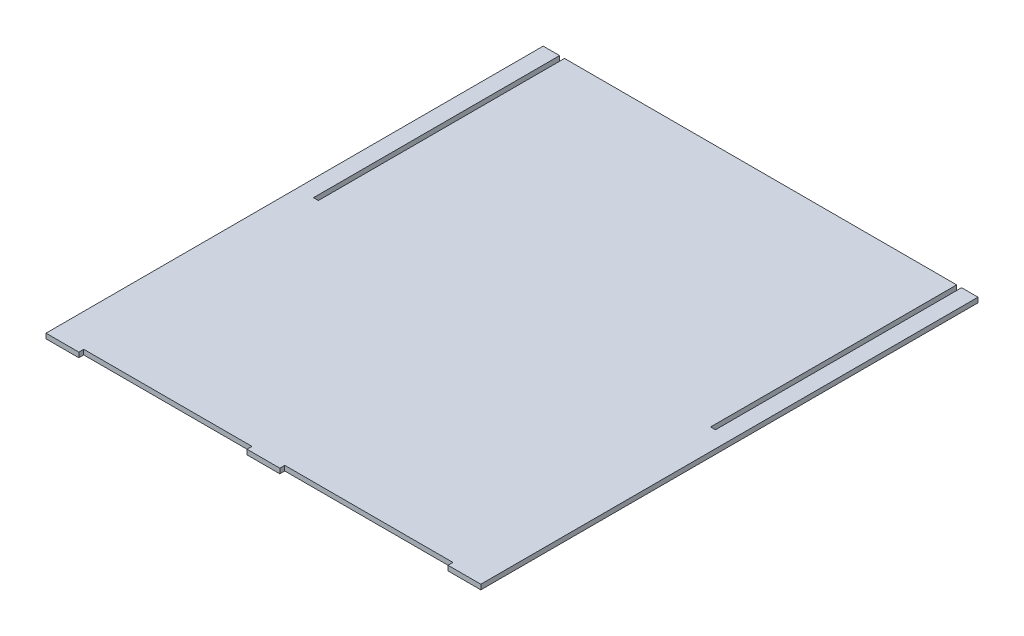
ISO-10303-21;
HEADER;
FILE_DESCRIPTION(('STEP AP214'),'2;1');
FILE_NAME('part.step','',(''),(''),'','','');
FILE_SCHEMA(('AUTOMOTIVE_DESIGN { 1 0 10303 214 1 1 1 1 }'));
ENDSEC;
DATA;
#1=APPLICATION_CONTEXT('core data for automotive mechanical design processes');
#2=APPLICATION_PROTOCOL_DEFINITION('international standard','automotive_design',2000,#1);
#3=PRODUCT_CONTEXT('',#1,'mechanical');
#4=PRODUCT('Part','Part','',(#3));
#5=PRODUCT_RELATED_PRODUCT_CATEGORY('part','',(#4));
#6=PRODUCT_DEFINITION_FORMATION('','',#4);
#7=PRODUCT_DEFINITION_CONTEXT('part definition',#1,'design');
#8=PRODUCT_DEFINITION('design','',#6,#7);
#9=PRODUCT_DEFINITION_SHAPE('','',#8);
#10=(LENGTH_UNIT() NAMED_UNIT(*) SI_UNIT(.MILLI.,.METRE.));
#11=(NAMED_UNIT(*) PLANE_ANGLE_UNIT() SI_UNIT($,.RADIAN.));
#12=(NAMED_UNIT(*) SI_UNIT($,.STERADIAN.) SOLID_ANGLE_UNIT());
#13=UNCERTAINTY_MEASURE_WITH_UNIT(LENGTH_MEASURE(1.E-05),#10,'distance_accuracy_value','');
#14=(GEOMETRIC_REPRESENTATION_CONTEXT(3) GLOBAL_UNCERTAINTY_ASSIGNED_CONTEXT((#13)) GLOBAL_UNIT_ASSIGNED_CONTEXT((#10,
#11,#12)) REPRESENTATION_CONTEXT('',''));
#15=CARTESIAN_POINT('',(0.,0.,0.));
#16=DIRECTION('',(0.,0.,1.));
#17=DIRECTION('',(1.,0.,0.));
#18=AXIS2_PLACEMENT_3D('',#15,#16,#17);
#19=CARTESIAN_POINT('',(0.,6.,-606.));
#20=DIRECTION('',(0.,0.,1.));
#21=DIRECTION('',(1.,0.,0.));
#22=AXIS2_PLACEMENT_3D('',#19,#20,#21);
#23=PLANE('',#22);
#24=DIRECTION('',(-1.,0.,0.));
#25=VECTOR('',#24,1.);
#26=CARTESIAN_POINT('',(0.,0.,-606.));
#27=LINE('',#26,#25);
#28=CARTESIAN_POINT('',(-26.,0.,-606.));
#29=VERTEX_POINT('',#28);
#30=CARTESIAN_POINT('',(-504.,0.,-606.));
#31=VERTEX_POINT('',#30);
#32=EDGE_CURVE('E194',#29,#31,#27,.T.);
#33=ORIENTED_EDGE('',*,*,#32,.T.);
#34=DIRECTION('',(0.,1.,0.));
#35=VECTOR('',#34,1.);
#36=CARTESIAN_POINT('',(-504.,0.,-606.));
#37=LINE('',#36,#35);
#38=CARTESIAN_POINT('',(-504.,6.,-606.));
#39=VERTEX_POINT('',#38);
#40=EDGE_CURVE('E178',#31,#39,#37,.T.);
#41=ORIENTED_EDGE('',*,*,#40,.T.);
#42=DIRECTION('',(-1.,0.,0.));
#43=VECTOR('',#42,1.);
#44=CARTESIAN_POINT('',(0.,6.,-606.));
#45=LINE('',#44,#43);
#46=CARTESIAN_POINT('',(-26.,6.,-606.));
#47=VERTEX_POINT('',#46);
#48=EDGE_CURVE('E339',#47,#39,#45,.T.);
#49=ORIENTED_EDGE('',*,*,#48,.F.);
#50=DIRECTION('',(0.,1.,0.));
#51=VECTOR('',#50,1.);
#52=CARTESIAN_POINT('',(-26.,0.,-606.));
#53=LINE('',#52,#51);
#54=EDGE_CURVE('E200',#29,#47,#53,.T.);
#55=ORIENTED_EDGE('',*,*,#54,.F.);
#56=EDGE_LOOP('',(#33,#41,#49,#55));
#57=FACE_BOUND('',#56,.T.);
#58=ADVANCED_FACE('F41',(#57),#23,.F.);
#59=CARTESIAN_POINT('',(0.,0.,-606.));
#60=VERTEX_POINT('',#59);
#61=CARTESIAN_POINT('',(-20.,0.,-606.));
#62=VERTEX_POINT('',#61);
#63=EDGE_CURVE('E201',#60,#62,#27,.T.);
#64=ORIENTED_EDGE('',*,*,#63,.T.);
#65=DIRECTION('',(0.,1.,0.));
#66=VECTOR('',#65,1.);
#67=CARTESIAN_POINT('',(-20.,0.,-606.));
#68=LINE('',#67,#66);
#69=CARTESIAN_POINT('',(-20.,6.,-606.));
#70=VERTEX_POINT('',#69);
#71=EDGE_CURVE('E300',#62,#70,#68,.T.);
#72=ORIENTED_EDGE('',*,*,#71,.T.);
#73=CARTESIAN_POINT('',(0.,6.,-606.));
#74=VERTEX_POINT('',#73);
#75=EDGE_CURVE('E285',#74,#70,#45,.T.);
#76=ORIENTED_EDGE('',*,*,#75,.F.);
#77=DIRECTION('',(0.,-1.,0.));
#78=VECTOR('',#77,1.);
#79=CARTESIAN_POINT('',(0.,6.,-606.));
#80=LINE('',#79,#78);
#81=EDGE_CURVE('E219',#74,#60,#80,.T.);
#82=ORIENTED_EDGE('',*,*,#81,.T.);
#83=EDGE_LOOP('',(#64,#72,#76,#82));
#84=FACE_BOUND('',#83,.T.);
#85=ADVANCED_FACE('F282',(#84),#23,.F.);
#86=CARTESIAN_POINT('',(-530.,6.,0.));
#87=DIRECTION('',(0.,0.,-1.));
#88=DIRECTION('',(-1.,0.,0.));
#89=AXIS2_PLACEMENT_3D('',#86,#87,#88);
#90=PLANE('',#89);
#91=DIRECTION('',(1.,0.,0.));
#92=VECTOR('',#91,1.);
#93=CARTESIAN_POINT('',(-530.,0.,0.));
#94=LINE('',#93,#92);
#95=CARTESIAN_POINT('',(-530.,0.,0.));
#96=VERTEX_POINT('',#95);
#97=CARTESIAN_POINT('',(-490.,0.,0.));
#98=VERTEX_POINT('',#97);
#99=EDGE_CURVE('E252',#96,#98,#94,.T.);
#100=ORIENTED_EDGE('',*,*,#99,.T.);
#101=DIRECTION('',(0.,-1.,0.));
#102=VECTOR('',#101,1.);
#103=CARTESIAN_POINT('',(-490.,6.,0.));
#104=LINE('',#103,#102);
#105=CARTESIAN_POINT('',(-490.,6.,0.));
#106=VERTEX_POINT('',#105);
#107=EDGE_CURVE('E11',#106,#98,#104,.T.);
#108=ORIENTED_EDGE('',*,*,#107,.F.);
#109=DIRECTION('',(1.,0.,0.));
#110=VECTOR('',#109,1.);
#111=CARTESIAN_POINT('',(-530.,6.,0.));
#112=LINE('',#111,#110);
#113=CARTESIAN_POINT('',(-530.,6.,0.));
#114=VERTEX_POINT('',#113);
#115=EDGE_CURVE('E212',#114,#106,#112,.T.);
#116=ORIENTED_EDGE('',*,*,#115,.F.);
#117=DIRECTION('',(0.,-1.,0.));
#118=VECTOR('',#117,1.);
#119=CARTESIAN_POINT('',(-530.,6.,0.));
#120=LINE('',#119,#118);
#121=EDGE_CURVE('E213',#114,#96,#120,.T.);
#122=ORIENTED_EDGE('',*,*,#121,.T.);
#123=EDGE_LOOP('',(#100,#108,#116,#122));
#124=FACE_BOUND('',#123,.T.);
#125=ADVANCED_FACE('F43',(#124),#90,.F.);
#126=CARTESIAN_POINT('',(-490.,6.,0.));
#127=DIRECTION('',(-1.,0.,0.));
#128=DIRECTION('',(0.,0.,1.));
#129=AXIS2_PLACEMENT_3D('',#126,#127,#128);
#130=PLANE('',#129);
#131=DIRECTION('',(0.,0.,-1.));
#132=VECTOR('',#131,1.);
#133=CARTESIAN_POINT('',(-490.,0.,0.));
#134=LINE('',#133,#132);
#135=CARTESIAN_POINT('',(-490.,0.,-6.));
#136=VERTEX_POINT('',#135);
#137=EDGE_CURVE('E247',#98,#136,#134,.T.);
#138=ORIENTED_EDGE('',*,*,#137,.T.);
#139=DIRECTION('',(0.,-1.,0.));
#140=VECTOR('',#139,1.);
#141=CARTESIAN_POINT('',(-490.,6.,-6.));
#142=LINE('',#141,#140);
#143=CARTESIAN_POINT('',(-490.,6.,-6.));
#144=VERTEX_POINT('',#143);
#145=EDGE_CURVE('E49',#144,#136,#142,.T.);
#146=ORIENTED_EDGE('',*,*,#145,.F.);
#147=DIRECTION('',(0.,0.,-1.));
#148=VECTOR('',#147,1.);
#149=CARTESIAN_POINT('',(-490.,6.,0.));
#150=LINE('',#149,#148);
#151=EDGE_CURVE('E314',#106,#144,#150,.T.);
#152=ORIENTED_EDGE('',*,*,#151,.F.);
#153=ORIENTED_EDGE('',*,*,#107,.T.);
#154=EDGE_LOOP('',(#138,#146,#152,#153));
#155=FACE_BOUND('',#154,.T.);
#156=ADVANCED_FACE('F248',(#155),#130,.F.);
#157=CARTESIAN_POINT('',(-285.,6.,-6.));
#158=DIRECTION('',(0.,0.,1.));
#159=DIRECTION('',(1.,0.,0.));
#160=AXIS2_PLACEMENT_3D('',#157,#158,#159);
#161=PLANE('',#160);
#162=DIRECTION('',(-1.,0.,0.));
#163=VECTOR('',#162,1.);
#164=CARTESIAN_POINT('',(-285.,0.,-6.));
#165=LINE('',#164,#163);
#166=CARTESIAN_POINT('',(-285.,0.,-6.));
#167=VERTEX_POINT('',#166);
#168=EDGE_CURVE('E242',#167,#136,#165,.T.);
#169=ORIENTED_EDGE('',*,*,#168,.F.);
#170=DIRECTION('',(0.,-1.,0.));
#171=VECTOR('',#170,1.);
#172=CARTESIAN_POINT('',(-285.,6.,-6.));
#173=LINE('',#172,#171);
#174=CARTESIAN_POINT('',(-285.,6.,-6.));
#175=VERTEX_POINT('',#174);
#176=EDGE_CURVE('E234',#175,#167,#173,.T.);
#177=ORIENTED_EDGE('',*,*,#176,.F.);
#178=DIRECTION('',(-1.,0.,0.));
#179=VECTOR('',#178,1.);
#180=CARTESIAN_POINT('',(-285.,6.,-6.));
#181=LINE('',#180,#179);
#182=EDGE_CURVE('E245',#175,#144,#181,.T.);
#183=ORIENTED_EDGE('',*,*,#182,.T.);
#184=ORIENTED_EDGE('',*,*,#145,.T.);
#185=EDGE_LOOP('',(#169,#177,#183,#184));
#186=FACE_BOUND('',#185,.T.);
#187=ADVANCED_FACE('F240',(#186),#161,.T.);
#188=CARTESIAN_POINT('',(-285.,6.,0.));
#189=DIRECTION('',(-1.,0.,0.));
#190=DIRECTION('',(0.,0.,1.));
#191=AXIS2_PLACEMENT_3D('',#188,#189,#190);
#192=PLANE('',#191);
#193=DIRECTION('',(0.,0.,-1.));
#194=VECTOR('',#193,1.);
#195=CARTESIAN_POINT('',(-285.,0.,0.));
#196=LINE('',#195,#194);
#197=CARTESIAN_POINT('',(-285.,0.,0.));
#198=VERTEX_POINT('',#197);
#199=EDGE_CURVE('E256',#198,#167,#196,.T.);
#200=ORIENTED_EDGE('',*,*,#199,.F.);
#201=DIRECTION('',(0.,-1.,0.));
#202=VECTOR('',#201,1.);
#203=CARTESIAN_POINT('',(-285.,6.,0.));
#204=LINE('',#203,#202);
#205=CARTESIAN_POINT('',(-285.,6.,0.));
#206=VERTEX_POINT('',#205);
#207=EDGE_CURVE('E232',#206,#198,#204,.T.);
#208=ORIENTED_EDGE('',*,*,#207,.F.);
#209=DIRECTION('',(0.,0.,-1.));
#210=VECTOR('',#209,1.);
#211=CARTESIAN_POINT('',(-285.,6.,0.));
#212=LINE('',#211,#210);
#213=EDGE_CURVE('E317',#206,#175,#212,.T.);
#214=ORIENTED_EDGE('',*,*,#213,.T.);
#215=ORIENTED_EDGE('',*,*,#176,.T.);
#216=EDGE_LOOP('',(#200,#208,#214,#215));
#217=FACE_BOUND('',#216,.T.);
#218=ADVANCED_FACE('F416',(#217),#192,.T.);
#219=CARTESIAN_POINT('',(-245.,6.,0.));
#220=DIRECTION('',(0.,0.,1.));
#221=DIRECTION('',(1.,0.,0.));
#222=AXIS2_PLACEMENT_3D('',#219,#220,#221);
#223=PLANE('',#222);
#224=DIRECTION('',(-1.,0.,0.));
#225=VECTOR('',#224,1.);
#226=CARTESIAN_POINT('',(-245.,0.,0.));
#227=LINE('',#226,#225);
#228=CARTESIAN_POINT('',(-245.,0.,0.));
#229=VERTEX_POINT('',#228);
#230=EDGE_CURVE('E258',#229,#198,#227,.T.);
#231=ORIENTED_EDGE('',*,*,#230,.F.);
#232=DIRECTION('',(0.,-1.,0.));
#233=VECTOR('',#232,1.);
#234=CARTESIAN_POINT('',(-245.,6.,0.));
#235=LINE('',#234,#233);
#236=CARTESIAN_POINT('',(-245.,6.,0.));
#237=VERTEX_POINT('',#236);
#238=EDGE_CURVE('E230',#237,#229,#235,.T.);
#239=ORIENTED_EDGE('',*,*,#238,.F.);
#240=DIRECTION('',(-1.,0.,0.));
#241=VECTOR('',#240,1.);
#242=CARTESIAN_POINT('',(-245.,6.,0.));
#243=LINE('',#242,#241);
#244=EDGE_CURVE('E320',#237,#206,#243,.T.);
#245=ORIENTED_EDGE('',*,*,#244,.T.);
#246=ORIENTED_EDGE('',*,*,#207,.T.);
#247=EDGE_LOOP('',(#231,#239,#245,#246));
#248=FACE_BOUND('',#247,.T.);
#249=ADVANCED_FACE('F412',(#248),#223,.T.);
#250=CARTESIAN_POINT('',(-245.,6.,-6.));
#251=DIRECTION('',(1.,0.,0.));
#252=DIRECTION('',(0.,0.,-1.));
#253=AXIS2_PLACEMENT_3D('',#250,#251,#252);
#254=PLANE('',#253);
#255=DIRECTION('',(0.,0.,1.));
#256=VECTOR('',#255,1.);
#257=CARTESIAN_POINT('',(-245.,0.,-6.));
#258=LINE('',#257,#256);
#259=CARTESIAN_POINT('',(-245.,0.,-6.));
#260=VERTEX_POINT('',#259);
#261=EDGE_CURVE('E263',#260,#229,#258,.T.);
#262=ORIENTED_EDGE('',*,*,#261,.F.);
#263=DIRECTION('',(0.,-1.,0.));
#264=VECTOR('',#263,1.);
#265=CARTESIAN_POINT('',(-245.,6.,-6.));
#266=LINE('',#265,#264);
#267=CARTESIAN_POINT('',(-245.,6.,-6.));
#268=VERTEX_POINT('',#267);
#269=EDGE_CURVE('E228',#268,#260,#266,.T.);
#270=ORIENTED_EDGE('',*,*,#269,.F.);
#271=DIRECTION('',(0.,0.,1.));
#272=VECTOR('',#271,1.);
#273=CARTESIAN_POINT('',(-245.,6.,-6.));
#274=LINE('',#273,#272);
#275=EDGE_CURVE('E323',#268,#237,#274,.T.);
#276=ORIENTED_EDGE('',*,*,#275,.T.);
#277=ORIENTED_EDGE('',*,*,#238,.T.);
#278=EDGE_LOOP('',(#262,#270,#276,#277));
#279=FACE_BOUND('',#278,.T.);
#280=ADVANCED_FACE('F408',(#279),#254,.T.);
#281=CARTESIAN_POINT('',(-40.,6.,-5.99999999999999));
#282=DIRECTION('',(0.,0.,1.));
#283=DIRECTION('',(1.,0.,0.));
#284=AXIS2_PLACEMENT_3D('',#281,#282,#283);
#285=PLANE('',#284);
#286=DIRECTION('',(-1.,0.,0.));
#287=VECTOR('',#286,1.);
#288=CARTESIAN_POINT('',(-40.,0.,-5.99999999999999));
#289=LINE('',#288,#287);
#290=CARTESIAN_POINT('',(-40.,0.,-5.99999999999999));
#291=VERTEX_POINT('',#290);
#292=EDGE_CURVE('E266',#291,#260,#289,.T.);
#293=ORIENTED_EDGE('',*,*,#292,.F.);
#294=DIRECTION('',(0.,-1.,0.));
#295=VECTOR('',#294,1.);
#296=CARTESIAN_POINT('',(-40.,6.,-5.99999999999999));
#297=LINE('',#296,#295);
#298=CARTESIAN_POINT('',(-40.,6.,-5.99999999999999));
#299=VERTEX_POINT('',#298);
#300=EDGE_CURVE('E226',#299,#291,#297,.T.);
#301=ORIENTED_EDGE('',*,*,#300,.F.);
#302=DIRECTION('',(-1.,0.,0.));
#303=VECTOR('',#302,1.);
#304=CARTESIAN_POINT('',(-40.,6.,-5.99999999999999));
#305=LINE('',#304,#303);
#306=EDGE_CURVE('E326',#299,#268,#305,.T.);
#307=ORIENTED_EDGE('',*,*,#306,.T.);
#308=ORIENTED_EDGE('',*,*,#269,.T.);
#309=EDGE_LOOP('',(#293,#301,#307,#308));
#310=FACE_BOUND('',#309,.T.);
#311=ADVANCED_FACE('F404',(#310),#285,.T.);
#312=CARTESIAN_POINT('',(-40.,6.,0.));
#313=DIRECTION('',(-1.,0.,0.));
#314=DIRECTION('',(0.,0.,1.));
#315=AXIS2_PLACEMENT_3D('',#312,#313,#314);
#316=PLANE('',#315);
#317=DIRECTION('',(0.,0.,-1.));
#318=VECTOR('',#317,1.);
#319=CARTESIAN_POINT('',(-40.,0.,0.));
#320=LINE('',#319,#318);
#321=CARTESIAN_POINT('',(-40.,0.,0.));
#322=VERTEX_POINT('',#321);
#323=EDGE_CURVE('E269',#322,#291,#320,.T.);
#324=ORIENTED_EDGE('',*,*,#323,.F.);
#325=DIRECTION('',(0.,-1.,0.));
#326=VECTOR('',#325,1.);
#327=CARTESIAN_POINT('',(-40.,6.,0.));
#328=LINE('',#327,#326);
#329=CARTESIAN_POINT('',(-40.,6.,0.));
#330=VERTEX_POINT('',#329);
#331=EDGE_CURVE('E224',#330,#322,#328,.T.);
#332=ORIENTED_EDGE('',*,*,#331,.F.);
#333=DIRECTION('',(0.,0.,-1.));
#334=VECTOR('',#333,1.);
#335=CARTESIAN_POINT('',(-40.,6.,0.));
#336=LINE('',#335,#334);
#337=EDGE_CURVE('E329',#330,#299,#336,.T.);
#338=ORIENTED_EDGE('',*,*,#337,.T.);
#339=ORIENTED_EDGE('',*,*,#300,.T.);
#340=EDGE_LOOP('',(#324,#332,#338,#339));
#341=FACE_BOUND('',#340,.T.);
#342=ADVANCED_FACE('F398',(#341),#316,.T.);
#343=CARTESIAN_POINT('',(0.,6.,0.));
#344=DIRECTION('',(0.,0.,1.));
#345=DIRECTION('',(1.,0.,0.));
#346=AXIS2_PLACEMENT_3D('',#343,#344,#345);
#347=PLANE('',#346);
#348=DIRECTION('',(-1.,0.,0.));
#349=VECTOR('',#348,1.);
#350=CARTESIAN_POINT('',(0.,0.,0.));
#351=LINE('',#350,#349);
#352=CARTESIAN_POINT('',(0.,0.,0.));
#353=VERTEX_POINT('',#352);
#354=EDGE_CURVE('E271',#353,#322,#351,.T.);
#355=ORIENTED_EDGE('',*,*,#354,.F.);
#356=DIRECTION('',(0.,-1.,0.));
#357=VECTOR('',#356,1.);
#358=CARTESIAN_POINT('',(0.,6.,0.));
#359=LINE('',#358,#357);
#360=CARTESIAN_POINT('',(0.,6.,0.));
#361=VERTEX_POINT('',#360);
#362=EDGE_CURVE('E222',#361,#353,#359,.T.);
#363=ORIENTED_EDGE('',*,*,#362,.F.);
#364=DIRECTION('',(-1.,0.,0.));
#365=VECTOR('',#364,1.);
#366=CARTESIAN_POINT('',(0.,6.,0.));
#367=LINE('',#366,#365);
#368=EDGE_CURVE('E332',#361,#330,#367,.T.);
#369=ORIENTED_EDGE('',*,*,#368,.T.);
#370=ORIENTED_EDGE('',*,*,#331,.T.);
#371=EDGE_LOOP('',(#355,#363,#369,#370));
#372=FACE_BOUND('',#371,.T.);
#373=ADVANCED_FACE('F394',(#372),#347,.T.);
#374=CARTESIAN_POINT('',(0.,6.,0.));
#375=DIRECTION('',(-1.,0.,0.));
#376=DIRECTION('',(0.,0.,1.));
#377=AXIS2_PLACEMENT_3D('',#374,#375,#376);
#378=PLANE('',#377);
#379=DIRECTION('',(0.,0.,-1.));
#380=VECTOR('',#379,1.);
#381=CARTESIAN_POINT('',(0.,0.,0.));
#382=LINE('',#381,#380);
#383=EDGE_CURVE('E206',#353,#60,#382,.T.);
#384=ORIENTED_EDGE('',*,*,#383,.T.);
#385=ORIENTED_EDGE('',*,*,#81,.F.);
#386=DIRECTION('',(0.,0.,-1.));
#387=VECTOR('',#386,1.);
#388=CARTESIAN_POINT('',(0.,6.,0.));
#389=LINE('',#388,#387);
#390=EDGE_CURVE('E335',#361,#74,#389,.T.);
#391=ORIENTED_EDGE('',*,*,#390,.F.);
#392=ORIENTED_EDGE('',*,*,#362,.T.);
#393=EDGE_LOOP('',(#384,#385,#391,#392));
#394=FACE_BOUND('',#393,.T.);
#395=ADVANCED_FACE('F277',(#394),#378,.F.);
#396=CARTESIAN_POINT('',(-510.,6.,-606.));
#397=VERTEX_POINT('',#396);
#398=CARTESIAN_POINT('',(-530.,6.,-606.));
#399=VERTEX_POINT('',#398);
#400=EDGE_CURVE('E337',#397,#399,#45,.T.);
#401=ORIENTED_EDGE('',*,*,#400,.F.);
#402=DIRECTION('',(0.,1.,0.));
#403=VECTOR('',#402,1.);
#404=CARTESIAN_POINT('',(-510.,0.,-606.));
#405=LINE('',#404,#403);
#406=CARTESIAN_POINT('',(-510.,0.,-606.));
#407=VERTEX_POINT('',#406);
#408=EDGE_CURVE('E188',#407,#397,#405,.T.);
#409=ORIENTED_EDGE('',*,*,#408,.F.);
#410=CARTESIAN_POINT('',(-530.,0.,-606.));
#411=VERTEX_POINT('',#410);
#412=EDGE_CURVE('E202',#407,#411,#27,.T.);
#413=ORIENTED_EDGE('',*,*,#412,.T.);
#414=DIRECTION('',(0.,-1.,0.));
#415=VECTOR('',#414,1.);
#416=CARTESIAN_POINT('',(-530.,6.,-606.));
#417=LINE('',#416,#415);
#418=EDGE_CURVE('E215',#399,#411,#417,.T.);
#419=ORIENTED_EDGE('',*,*,#418,.F.);
#420=EDGE_LOOP('',(#401,#409,#413,#419));
#421=FACE_BOUND('',#420,.T.);
#422=ADVANCED_FACE('F351',(#421),#23,.F.);
#423=CARTESIAN_POINT('',(-530.,6.,0.));
#424=DIRECTION('',(-1.,0.,0.));
#425=DIRECTION('',(0.,0.,1.));
#426=AXIS2_PLACEMENT_3D('',#423,#424,#425);
#427=PLANE('',#426);
#428=DIRECTION('',(0.,0.,-1.));
#429=VECTOR('',#428,1.);
#430=CARTESIAN_POINT('',(-530.,0.,0.));
#431=LINE('',#430,#429);
#432=EDGE_CURVE('E205',#96,#411,#431,.T.);
#433=ORIENTED_EDGE('',*,*,#432,.F.);
#434=ORIENTED_EDGE('',*,*,#121,.F.);
#435=DIRECTION('',(0.,0.,-1.));
#436=VECTOR('',#435,1.);
#437=CARTESIAN_POINT('',(-530.,6.,0.));
#438=LINE('',#437,#436);
#439=EDGE_CURVE('E216',#114,#399,#438,.T.);
#440=ORIENTED_EDGE('',*,*,#439,.T.);
#441=ORIENTED_EDGE('',*,*,#418,.T.);
#442=EDGE_LOOP('',(#433,#434,#440,#441));
#443=FACE_BOUND('',#442,.T.);
#444=ADVANCED_FACE('F346',(#443),#427,.T.);
#445=CARTESIAN_POINT('',(0.,6.,0.));
#446=DIRECTION('',(0.,1.,0.));
#447=DIRECTION('',(0.,0.,1.));
#448=AXIS2_PLACEMENT_3D('',#445,#446,#447);
#449=PLANE('',#448);
#450=DIRECTION('',(0.,0.,-1.));
#451=VECTOR('',#450,1.);
#452=CARTESIAN_POINT('',(-504.,6.,-606.));
#453=LINE('',#452,#451);
#454=CARTESIAN_POINT('',(-504.,6.,-306.));
#455=VERTEX_POINT('',#454);
#456=EDGE_CURVE('E183',#455,#39,#453,.T.);
#457=ORIENTED_EDGE('',*,*,#456,.F.);
#458=DIRECTION('',(1.,0.,0.));
#459=VECTOR('',#458,1.);
#460=CARTESIAN_POINT('',(-504.,6.,-306.));
#461=LINE('',#460,#459);
#462=CARTESIAN_POINT('',(-510.,6.,-306.));
#463=VERTEX_POINT('',#462);
#464=EDGE_CURVE('E197',#463,#455,#461,.T.);
#465=ORIENTED_EDGE('',*,*,#464,.F.);
#466=DIRECTION('',(0.,0.,1.));
#467=VECTOR('',#466,1.);
#468=CARTESIAN_POINT('',(-510.,6.,-606.));
#469=LINE('',#468,#467);
#470=EDGE_CURVE('E358',#397,#463,#469,.T.);
#471=ORIENTED_EDGE('',*,*,#470,.F.);
#472=ORIENTED_EDGE('',*,*,#400,.T.);
#473=ORIENTED_EDGE('',*,*,#439,.F.);
#474=ORIENTED_EDGE('',*,*,#115,.T.);
#475=ORIENTED_EDGE('',*,*,#151,.T.);
#476=ORIENTED_EDGE('',*,*,#182,.F.);
#477=ORIENTED_EDGE('',*,*,#213,.F.);
#478=ORIENTED_EDGE('',*,*,#244,.F.);
#479=ORIENTED_EDGE('',*,*,#275,.F.);
#480=ORIENTED_EDGE('',*,*,#306,.F.);
#481=ORIENTED_EDGE('',*,*,#337,.F.);
#482=ORIENTED_EDGE('',*,*,#368,.F.);
#483=ORIENTED_EDGE('',*,*,#390,.T.);
#484=ORIENTED_EDGE('',*,*,#75,.T.);
#485=DIRECTION('',(0.,0.,-1.));
#486=VECTOR('',#485,1.);
#487=CARTESIAN_POINT('',(-20.,6.,-606.));
#488=LINE('',#487,#486);
#489=CARTESIAN_POINT('',(-20.,6.,-306.));
#490=VERTEX_POINT('',#489);
#491=EDGE_CURVE('E301',#490,#70,#488,.T.);
#492=ORIENTED_EDGE('',*,*,#491,.F.);
#493=DIRECTION('',(1.,0.,0.));
#494=VECTOR('',#493,1.);
#495=CARTESIAN_POINT('',(-20.,6.,-306.));
#496=LINE('',#495,#494);
#497=CARTESIAN_POINT('',(-26.,6.,-306.));
#498=VERTEX_POINT('',#497);
#499=EDGE_CURVE('E291',#498,#490,#496,.T.);
#500=ORIENTED_EDGE('',*,*,#499,.F.);
#501=DIRECTION('',(0.,0.,1.));
#502=VECTOR('',#501,1.);
#503=CARTESIAN_POINT('',(-26.,6.,-606.));
#504=LINE('',#503,#502);
#505=EDGE_CURVE('E295',#47,#498,#504,.T.);
#506=ORIENTED_EDGE('',*,*,#505,.F.);
#507=ORIENTED_EDGE('',*,*,#48,.T.);
#508=EDGE_LOOP('',(#457,#465,#471,#472,#473,#474,#475,#476,#477,#478,#479,#480,#481,#482,#483,
#484,#492,#500,#506,#507));
#509=FACE_BOUND('',#508,.T.);
#510=ADVANCED_FACE('F369',(#509),#449,.T.);
#511=CARTESIAN_POINT('',(0.,0.,0.));
#512=DIRECTION('',(0.,1.,0.));
#513=DIRECTION('',(0.,0.,1.));
#514=AXIS2_PLACEMENT_3D('',#511,#512,#513);
#515=PLANE('',#514);
#516=DIRECTION('',(1.,0.,0.));
#517=VECTOR('',#516,1.);
#518=CARTESIAN_POINT('',(-504.,0.,-306.));
#519=LINE('',#518,#517);
#520=CARTESIAN_POINT('',(-510.,0.,-306.));
#521=VERTEX_POINT('',#520);
#522=CARTESIAN_POINT('',(-504.,0.,-306.));
#523=VERTEX_POINT('',#522);
#524=EDGE_CURVE('E56',#521,#523,#519,.T.);
#525=ORIENTED_EDGE('',*,*,#524,.T.);
#526=DIRECTION('',(0.,0.,-1.));
#527=VECTOR('',#526,1.);
#528=CARTESIAN_POINT('',(-504.,0.,-606.));
#529=LINE('',#528,#527);
#530=EDGE_CURVE('E181',#523,#31,#529,.T.);
#531=ORIENTED_EDGE('',*,*,#530,.T.);
#532=ORIENTED_EDGE('',*,*,#32,.F.);
#533=DIRECTION('',(0.,0.,1.));
#534=VECTOR('',#533,1.);
#535=CARTESIAN_POINT('',(-26.,0.,-606.));
#536=LINE('',#535,#534);
#537=CARTESIAN_POINT('',(-26.,0.,-306.));
#538=VERTEX_POINT('',#537);
#539=EDGE_CURVE('E290',#29,#538,#536,.T.);
#540=ORIENTED_EDGE('',*,*,#539,.T.);
#541=DIRECTION('',(1.,0.,0.));
#542=VECTOR('',#541,1.);
#543=CARTESIAN_POINT('',(-20.,0.,-306.));
#544=LINE('',#543,#542);
#545=CARTESIAN_POINT('',(-20.,0.,-306.));
#546=VERTEX_POINT('',#545);
#547=EDGE_CURVE('E64',#538,#546,#544,.T.);
#548=ORIENTED_EDGE('',*,*,#547,.T.);
#549=DIRECTION('',(0.,0.,-1.));
#550=VECTOR('',#549,1.);
#551=CARTESIAN_POINT('',(-20.,0.,-606.));
#552=LINE('',#551,#550);
#553=EDGE_CURVE('E288',#546,#62,#552,.T.);
#554=ORIENTED_EDGE('',*,*,#553,.T.);
#555=ORIENTED_EDGE('',*,*,#63,.F.);
#556=ORIENTED_EDGE('',*,*,#383,.F.);
#557=ORIENTED_EDGE('',*,*,#354,.T.);
#558=ORIENTED_EDGE('',*,*,#323,.T.);
#559=ORIENTED_EDGE('',*,*,#292,.T.);
#560=ORIENTED_EDGE('',*,*,#261,.T.);
#561=ORIENTED_EDGE('',*,*,#230,.T.);
#562=ORIENTED_EDGE('',*,*,#199,.T.);
#563=ORIENTED_EDGE('',*,*,#168,.T.);
#564=ORIENTED_EDGE('',*,*,#137,.F.);
#565=ORIENTED_EDGE('',*,*,#99,.F.);
#566=ORIENTED_EDGE('',*,*,#432,.T.);
#567=ORIENTED_EDGE('',*,*,#412,.F.);
#568=DIRECTION('',(0.,0.,1.));
#569=VECTOR('',#568,1.);
#570=CARTESIAN_POINT('',(-510.,0.,-606.));
#571=LINE('',#570,#569);
#572=EDGE_CURVE('E196',#407,#521,#571,.T.);
#573=ORIENTED_EDGE('',*,*,#572,.T.);
#574=EDGE_LOOP('',(#525,#531,#532,#540,#548,#554,#555,#556,#557,#558,#559,#560,#561,#562,#563,
#564,#565,#566,#567,#573));
#575=FACE_BOUND('',#574,.T.);
#576=ADVANCED_FACE('F192',(#575),#515,.F.);
#577=CARTESIAN_POINT('',(-20.,0.,-606.));
#578=DIRECTION('',(1.,0.,0.));
#579=DIRECTION('',(0.,0.,-1.));
#580=AXIS2_PLACEMENT_3D('',#577,#578,#579);
#581=PLANE('',#580);
#582=ORIENTED_EDGE('',*,*,#491,.T.);
#583=ORIENTED_EDGE('',*,*,#71,.F.);
#584=ORIENTED_EDGE('',*,*,#553,.F.);
#585=DIRECTION('',(0.,1.,0.));
#586=VECTOR('',#585,1.);
#587=CARTESIAN_POINT('',(-20.,0.,-306.));
#588=LINE('',#587,#586);
#589=EDGE_CURVE('E306',#546,#490,#588,.T.);
#590=ORIENTED_EDGE('',*,*,#589,.T.);
#591=EDGE_LOOP('',(#582,#583,#584,#590));
#592=FACE_BOUND('',#591,.T.);
#593=ADVANCED_FACE('F505',(#592),#581,.F.);
#594=CARTESIAN_POINT('',(-20.,0.,-306.));
#595=DIRECTION('',(0.,0.,1.));
#596=DIRECTION('',(1.,0.,0.));
#597=AXIS2_PLACEMENT_3D('',#594,#595,#596);
#598=PLANE('',#597);
#599=ORIENTED_EDGE('',*,*,#499,.T.);
#600=ORIENTED_EDGE('',*,*,#589,.F.);
#601=ORIENTED_EDGE('',*,*,#547,.F.);
#602=DIRECTION('',(0.,1.,0.));
#603=VECTOR('',#602,1.);
#604=CARTESIAN_POINT('',(-26.,0.,-306.));
#605=LINE('',#604,#603);
#606=EDGE_CURVE('E308',#538,#498,#605,.T.);
#607=ORIENTED_EDGE('',*,*,#606,.T.);
#608=EDGE_LOOP('',(#599,#600,#601,#607));
#609=FACE_BOUND('',#608,.T.);
#610=ADVANCED_FACE('F519',(#609),#598,.F.);
#611=CARTESIAN_POINT('',(-26.,0.,-606.));
#612=DIRECTION('',(-1.,0.,0.));
#613=DIRECTION('',(0.,0.,1.));
#614=AXIS2_PLACEMENT_3D('',#611,#612,#613);
#615=PLANE('',#614);
#616=ORIENTED_EDGE('',*,*,#505,.T.);
#617=ORIENTED_EDGE('',*,*,#606,.F.);
#618=ORIENTED_EDGE('',*,*,#539,.F.);
#619=ORIENTED_EDGE('',*,*,#54,.T.);
#620=EDGE_LOOP('',(#616,#617,#618,#619));
#621=FACE_BOUND('',#620,.T.);
#622=ADVANCED_FACE('F378',(#621),#615,.F.);
#623=CARTESIAN_POINT('',(-504.,0.,-606.));
#624=DIRECTION('',(1.,0.,0.));
#625=DIRECTION('',(0.,0.,-1.));
#626=AXIS2_PLACEMENT_3D('',#623,#624,#625);
#627=PLANE('',#626);
#628=ORIENTED_EDGE('',*,*,#456,.T.);
#629=ORIENTED_EDGE('',*,*,#40,.F.);
#630=ORIENTED_EDGE('',*,*,#530,.F.);
#631=DIRECTION('',(0.,1.,0.));
#632=VECTOR('',#631,1.);
#633=CARTESIAN_POINT('',(-504.,0.,-306.));
#634=LINE('',#633,#632);
#635=EDGE_CURVE('E303',#523,#455,#634,.T.);
#636=ORIENTED_EDGE('',*,*,#635,.T.);
#637=EDGE_LOOP('',(#628,#629,#630,#636));
#638=FACE_BOUND('',#637,.T.);
#639=ADVANCED_FACE('F180',(#638),#627,.F.);
#640=CARTESIAN_POINT('',(-504.,0.,-306.));
#641=DIRECTION('',(0.,0.,1.));
#642=DIRECTION('',(1.,0.,0.));
#643=AXIS2_PLACEMENT_3D('',#640,#641,#642);
#644=PLANE('',#643);
#645=ORIENTED_EDGE('',*,*,#464,.T.);
#646=ORIENTED_EDGE('',*,*,#635,.F.);
#647=ORIENTED_EDGE('',*,*,#524,.F.);
#648=DIRECTION('',(0.,1.,0.));
#649=VECTOR('',#648,1.);
#650=CARTESIAN_POINT('',(-510.,0.,-306.));
#651=LINE('',#650,#649);
#652=EDGE_CURVE('E364',#521,#463,#651,.T.);
#653=ORIENTED_EDGE('',*,*,#652,.T.);
#654=EDGE_LOOP('',(#645,#646,#647,#653));
#655=FACE_BOUND('',#654,.T.);
#656=ADVANCED_FACE('F370',(#655),#644,.F.);
#657=CARTESIAN_POINT('',(-510.,0.,-606.));
#658=DIRECTION('',(-1.,0.,0.));
#659=DIRECTION('',(0.,0.,1.));
#660=AXIS2_PLACEMENT_3D('',#657,#658,#659);
#661=PLANE('',#660);
#662=ORIENTED_EDGE('',*,*,#470,.T.);
#663=ORIENTED_EDGE('',*,*,#652,.F.);
#664=ORIENTED_EDGE('',*,*,#572,.F.);
#665=ORIENTED_EDGE('',*,*,#408,.T.);
#666=EDGE_LOOP('',(#662,#663,#664,#665));
#667=FACE_BOUND('',#666,.T.);
#668=ADVANCED_FACE('F366',(#667),#661,.F.);
#669=CLOSED_SHELL('',(#58,#85,#125,#156,#187,#218,#249,#280,#311,#342,#373,#395,#422,#444,#510,
#576,#593,#610,#622,#639,#656,#668));
#670=MANIFOLD_SOLID_BREP('B2',#669);
#671=ADVANCED_BREP_SHAPE_REPRESENTATION('',(#18,#670),#14);
#672=SHAPE_DEFINITION_REPRESENTATION(#9,#671);
ENDSEC;
END-ISO-10303-21;
